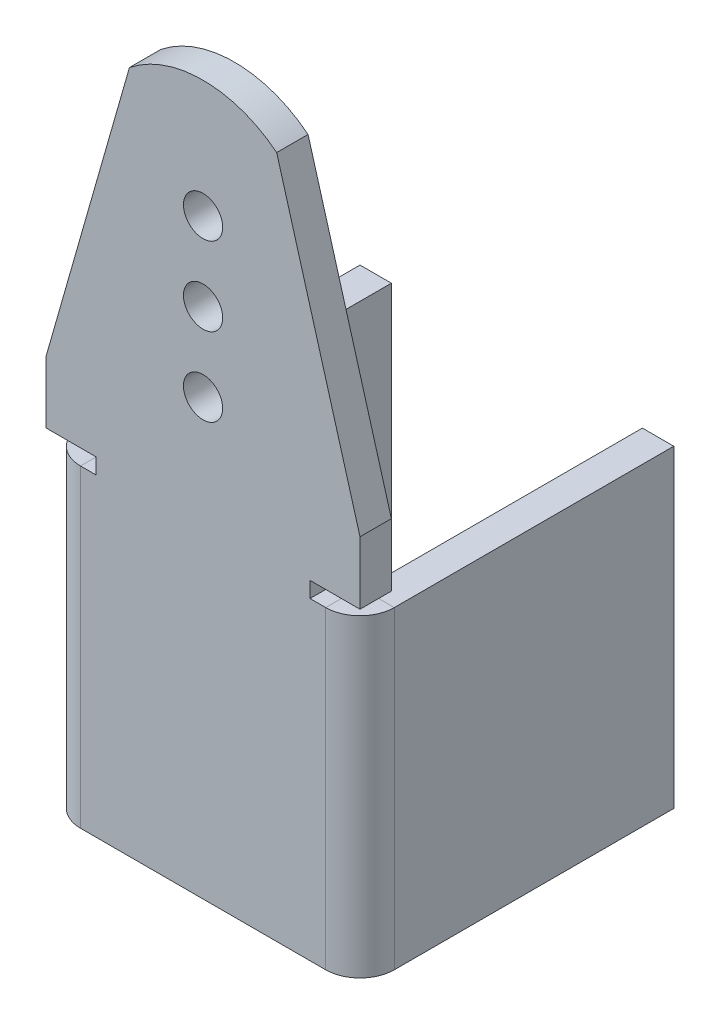
ISO-10303-21;
HEADER;
FILE_DESCRIPTION(('STEP AP214'),'2;1');
FILE_NAME('part.step','',(''),(''),'','','');
FILE_SCHEMA(('AUTOMOTIVE_DESIGN { 1 0 10303 214 1 1 1 1 }'));
ENDSEC;
DATA;
#1=APPLICATION_CONTEXT('core data for automotive mechanical design processes');
#2=APPLICATION_PROTOCOL_DEFINITION('international standard','automotive_design',2000,#1);
#3=PRODUCT_CONTEXT('',#1,'mechanical');
#4=PRODUCT('Part','Part','',(#3));
#5=PRODUCT_RELATED_PRODUCT_CATEGORY('part','',(#4));
#6=PRODUCT_DEFINITION_FORMATION('','',#4);
#7=PRODUCT_DEFINITION_CONTEXT('part definition',#1,'design');
#8=PRODUCT_DEFINITION('design','',#6,#7);
#9=PRODUCT_DEFINITION_SHAPE('','',#8);
#10=(LENGTH_UNIT() NAMED_UNIT(*) SI_UNIT(.MILLI.,.METRE.));
#11=(NAMED_UNIT(*) PLANE_ANGLE_UNIT() SI_UNIT($,.RADIAN.));
#12=(NAMED_UNIT(*) SI_UNIT($,.STERADIAN.) SOLID_ANGLE_UNIT());
#13=UNCERTAINTY_MEASURE_WITH_UNIT(LENGTH_MEASURE(1.E-05),#10,'distance_accuracy_value','');
#14=(GEOMETRIC_REPRESENTATION_CONTEXT(3) GLOBAL_UNCERTAINTY_ASSIGNED_CONTEXT((#13)) GLOBAL_UNIT_ASSIGNED_CONTEXT((#10,
#11,#12)) REPRESENTATION_CONTEXT('',''));
#15=CARTESIAN_POINT('',(0.,0.,0.));
#16=DIRECTION('',(0.,0.,1.));
#17=DIRECTION('',(1.,0.,0.));
#18=AXIS2_PLACEMENT_3D('',#15,#16,#17);
#19=CARTESIAN_POINT('',(39.9839854278637,150.82360777506,-8.));
#20=DIRECTION('',(0.,0.,-1.));
#21=DIRECTION('',(-1.,0.,0.));
#22=AXIS2_PLACEMENT_3D('',#19,#20,#21);
#23=PLANE('',#22);
#24=CARTESIAN_POINT('',(39.9839854278642,110.82360777506,-8.));
#25=DIRECTION('',(0.,0.,1.));
#26=DIRECTION('',(1.,0.,0.));
#27=AXIS2_PLACEMENT_3D('',#24,#25,#26);
#28=CIRCLE('',#27,5.);
#29=CARTESIAN_POINT('',(44.9839854278642,110.82360777506,-8.));
#30=VERTEX_POINT('',#29);
#31=EDGE_CURVE('E391',#30,#30,#28,.T.);
#32=ORIENTED_EDGE('',*,*,#31,.T.);
#33=EDGE_LOOP('',(#32));
#34=FACE_BOUND('',#33,.T.);
#35=CARTESIAN_POINT('',(39.9839854278639,130.82360777506,-8.));
#36=DIRECTION('',(0.,0.,1.));
#37=DIRECTION('',(1.,0.,0.));
#38=AXIS2_PLACEMENT_3D('',#35,#36,#37);
#39=CIRCLE('',#38,5.);
#40=CARTESIAN_POINT('',(44.9839854278639,130.82360777506,-8.));
#41=VERTEX_POINT('',#40);
#42=EDGE_CURVE('E397',#41,#41,#39,.T.);
#43=ORIENTED_EDGE('',*,*,#42,.T.);
#44=EDGE_LOOP('',(#43));
#45=FACE_BOUND('',#44,.T.);
#46=CARTESIAN_POINT('',(39.9839854278637,150.82360777506,-8.));
#47=DIRECTION('',(0.,0.,1.));
#48=DIRECTION('',(1.,0.,0.));
#49=AXIS2_PLACEMENT_3D('',#46,#47,#48);
#50=CIRCLE('',#49,5.);
#51=CARTESIAN_POINT('',(44.9839854278637,150.82360777506,-8.));
#52=VERTEX_POINT('',#51);
#53=EDGE_CURVE('E403',#52,#52,#50,.T.);
#54=ORIENTED_EDGE('',*,*,#53,.T.);
#55=EDGE_LOOP('',(#54));
#56=FACE_BOUND('',#55,.T.);
#57=DIRECTION('',(0.,-1.,0.));
#58=VECTOR('',#57,1.);
#59=CARTESIAN_POINT('',(12.7366,84.,-8.));
#60=LINE('',#59,#58);
#61=CARTESIAN_POINT('',(12.7366,84.,-8.));
#62=VERTEX_POINT('',#61);
#63=CARTESIAN_POINT('',(12.7366,80.,-8.));
#64=VERTEX_POINT('',#63);
#65=EDGE_CURVE('E308',#62,#64,#60,.T.);
#66=ORIENTED_EDGE('',*,*,#65,.F.);
#67=DIRECTION('',(1.,0.,0.));
#68=VECTOR('',#67,1.);
#69=CARTESIAN_POINT('',(0.,84.,-8.));
#70=LINE('',#69,#68);
#71=CARTESIAN_POINT('',(0.,84.,-8.));
#72=VERTEX_POINT('',#71);
#73=EDGE_CURVE('E304',#72,#62,#70,.T.);
#74=ORIENTED_EDGE('',*,*,#73,.F.);
#75=DIRECTION('',(0.,-1.,0.));
#76=VECTOR('',#75,1.);
#77=CARTESIAN_POINT('',(0.,0.,-8.));
#78=LINE('',#77,#76);
#79=CARTESIAN_POINT('',(0.,100.,-8.));
#80=VERTEX_POINT('',#79);
#81=EDGE_CURVE('E409',#80,#72,#78,.T.);
#82=ORIENTED_EDGE('',*,*,#81,.F.);
#83=DIRECTION('',(-0.274761416571079,-0.961512435678215,0.));
#84=VECTOR('',#83,1.);
#85=CARTESIAN_POINT('',(0.,100.,-8.));
#86=LINE('',#85,#84);
#87=CARTESIAN_POINT('',(21.2099630086313,174.223096705422,-8.));
#88=VERTEX_POINT('',#87);
#89=EDGE_CURVE('E423',#88,#80,#86,.T.);
#90=ORIENTED_EDGE('',*,*,#89,.F.);
#91=CARTESIAN_POINT('',(39.9839854278637,150.82360777506,-8.));
#92=DIRECTION('',(0.,0.,1.));
#93=DIRECTION('',(-1.,0.,0.));
#94=AXIS2_PLACEMENT_3D('',#91,#92,#93);
#95=CIRCLE('',#94,30.);
#96=CARTESIAN_POINT('',(58.7580078470961,174.223096705422,-8.));
#97=VERTEX_POINT('',#96);
#98=EDGE_CURVE('E420',#97,#88,#95,.T.);
#99=ORIENTED_EDGE('',*,*,#98,.F.);
#100=DIRECTION('',(-0.275144944227308,0.961402756219344,0.));
#101=VECTOR('',#100,1.);
#102=CARTESIAN_POINT('',(58.7580078470961,174.223096705422,-8.));
#103=LINE('',#102,#101);
#104=CARTESIAN_POINT('',(80.,100.,-8.));
#105=VERTEX_POINT('',#104);
#106=EDGE_CURVE('E417',#105,#97,#103,.T.);
#107=ORIENTED_EDGE('',*,*,#106,.F.);
#108=DIRECTION('',(0.,1.,0.));
#109=VECTOR('',#108,1.);
#110=CARTESIAN_POINT('',(80.,0.,-8.));
#111=LINE('',#110,#109);
#112=CARTESIAN_POINT('',(80.,84.,-8.));
#113=VERTEX_POINT('',#112);
#114=EDGE_CURVE('E415',#113,#105,#111,.T.);
#115=ORIENTED_EDGE('',*,*,#114,.F.);
#116=DIRECTION('',(1.,0.,0.));
#117=VECTOR('',#116,1.);
#118=CARTESIAN_POINT('',(67.2634,84.,-7.99999999999999));
#119=LINE('',#118,#117);
#120=CARTESIAN_POINT('',(67.2634,84.,-8.));
#121=VERTEX_POINT('',#120);
#122=EDGE_CURVE('E381',#121,#113,#119,.T.);
#123=ORIENTED_EDGE('',*,*,#122,.F.);
#124=DIRECTION('',(0.,1.,0.));
#125=VECTOR('',#124,1.);
#126=CARTESIAN_POINT('',(67.2634,80.,-7.99999999999999));
#127=LINE('',#126,#125);
#128=CARTESIAN_POINT('',(67.2634,80.,-8.));
#129=VERTEX_POINT('',#128);
#130=EDGE_CURVE('E377',#129,#121,#127,.T.);
#131=ORIENTED_EDGE('',*,*,#130,.F.);
#132=DIRECTION('',(-1.,0.,0.));
#133=VECTOR('',#132,1.);
#134=CARTESIAN_POINT('',(71.2634,80.,-7.99999999999999));
#135=LINE('',#134,#133);
#136=CARTESIAN_POINT('',(71.2634,80.,-8.));
#137=VERTEX_POINT('',#136);
#138=EDGE_CURVE('E106',#137,#129,#135,.T.);
#139=ORIENTED_EDGE('',*,*,#138,.F.);
#140=DIRECTION('',(0.,-1.,0.));
#141=VECTOR('',#140,1.);
#142=CARTESIAN_POINT('',(71.2634,0.,-7.99999999999999));
#143=LINE('',#142,#141);
#144=CARTESIAN_POINT('',(71.2634,0.,-8.));
#145=VERTEX_POINT('',#144);
#146=EDGE_CURVE('E364',#145,#137,#143,.F.);
#147=ORIENTED_EDGE('',*,*,#146,.F.);
#148=DIRECTION('',(1.,0.,0.));
#149=VECTOR('',#148,1.);
#150=CARTESIAN_POINT('',(0.,0.,-8.));
#151=LINE('',#150,#149);
#152=CARTESIAN_POINT('',(8.7366,0.,-8.));
#153=VERTEX_POINT('',#152);
#154=EDGE_CURVE('E412',#153,#145,#151,.T.);
#155=ORIENTED_EDGE('',*,*,#154,.F.);
#156=DIRECTION('',(0.,1.,0.));
#157=VECTOR('',#156,1.);
#158=CARTESIAN_POINT('',(8.7366,80.,-8.));
#159=LINE('',#158,#157);
#160=CARTESIAN_POINT('',(8.7366,80.,-8.));
#161=VERTEX_POINT('',#160);
#162=EDGE_CURVE('E294',#161,#153,#159,.F.);
#163=ORIENTED_EDGE('',*,*,#162,.F.);
#164=DIRECTION('',(-1.,0.,0.));
#165=VECTOR('',#164,1.);
#166=CARTESIAN_POINT('',(12.7366,80.,-8.));
#167=LINE('',#166,#165);
#168=EDGE_CURVE('E312',#64,#161,#167,.T.);
#169=ORIENTED_EDGE('',*,*,#168,.F.);
#170=EDGE_LOOP('',(#66,#74,#82,#90,#99,#107,#115,#123,#131,#139,#147,#155,#163,#169));
#171=FACE_BOUND('',#170,.T.);
#172=ADVANCED_FACE('F83',(#34,#45,#56,#171),#23,.T.);
#173=CARTESIAN_POINT('',(39.9839854278637,150.82360777506,0.));
#174=DIRECTION('',(0.,0.,-1.));
#175=DIRECTION('',(-1.,0.,0.));
#176=AXIS2_PLACEMENT_3D('',#173,#174,#175);
#177=PLANE('',#176);
#178=CARTESIAN_POINT('',(39.9839854278642,110.82360777506,0.));
#179=DIRECTION('',(0.,0.,1.));
#180=DIRECTION('',(1.,0.,0.));
#181=AXIS2_PLACEMENT_3D('',#178,#179,#180);
#182=CIRCLE('',#181,5.);
#183=CARTESIAN_POINT('',(44.9839854278642,110.82360777506,0.));
#184=VERTEX_POINT('',#183);
#185=EDGE_CURVE('E376',#184,#184,#182,.T.);
#186=ORIENTED_EDGE('',*,*,#185,.F.);
#187=EDGE_LOOP('',(#186));
#188=FACE_BOUND('',#187,.T.);
#189=CARTESIAN_POINT('',(39.9839854278639,130.82360777506,0.));
#190=DIRECTION('',(0.,0.,1.));
#191=DIRECTION('',(1.,0.,0.));
#192=AXIS2_PLACEMENT_3D('',#189,#190,#191);
#193=CIRCLE('',#192,5.);
#194=CARTESIAN_POINT('',(44.9839854278639,130.82360777506,0.));
#195=VERTEX_POINT('',#194);
#196=EDGE_CURVE('E394',#195,#195,#193,.T.);
#197=ORIENTED_EDGE('',*,*,#196,.F.);
#198=EDGE_LOOP('',(#197));
#199=FACE_BOUND('',#198,.T.);
#200=CARTESIAN_POINT('',(39.9839854278637,150.82360777506,0.));
#201=DIRECTION('',(0.,0.,1.));
#202=DIRECTION('',(1.,0.,0.));
#203=AXIS2_PLACEMENT_3D('',#200,#201,#202);
#204=CIRCLE('',#203,5.);
#205=CARTESIAN_POINT('',(44.9839854278637,150.82360777506,0.));
#206=VERTEX_POINT('',#205);
#207=EDGE_CURVE('E400',#206,#206,#204,.T.);
#208=ORIENTED_EDGE('',*,*,#207,.F.);
#209=EDGE_LOOP('',(#208));
#210=FACE_BOUND('',#209,.T.);
#211=DIRECTION('',(-1.,0.,0.));
#212=VECTOR('',#211,1.);
#213=CARTESIAN_POINT('',(39.9839854278637,84.,0.));
#214=LINE('',#213,#212);
#215=CARTESIAN_POINT('',(12.7366,84.,0.));
#216=VERTEX_POINT('',#215);
#217=CARTESIAN_POINT('',(0.,84.,0.));
#218=VERTEX_POINT('',#217);
#219=EDGE_CURVE('E98',#216,#218,#214,.T.);
#220=ORIENTED_EDGE('',*,*,#219,.F.);
#221=DIRECTION('',(0.,1.,0.));
#222=VECTOR('',#221,1.);
#223=CARTESIAN_POINT('',(12.7366,150.82360777506,0.));
#224=LINE('',#223,#222);
#225=CARTESIAN_POINT('',(12.7366,80.,0.));
#226=VERTEX_POINT('',#225);
#227=EDGE_CURVE('E13',#226,#216,#224,.T.);
#228=ORIENTED_EDGE('',*,*,#227,.F.);
#229=DIRECTION('',(1.,0.,0.));
#230=VECTOR('',#229,1.);
#231=CARTESIAN_POINT('',(39.9839854278637,80.,0.));
#232=LINE('',#231,#230);
#233=CARTESIAN_POINT('',(8.7366,80.,0.));
#234=VERTEX_POINT('',#233);
#235=EDGE_CURVE('E91',#234,#226,#232,.T.);
#236=ORIENTED_EDGE('',*,*,#235,.F.);
#237=DIRECTION('',(0.,1.,0.));
#238=VECTOR('',#237,1.);
#239=CARTESIAN_POINT('',(8.7366,80.,0.));
#240=LINE('',#239,#238);
#241=CARTESIAN_POINT('',(8.7366,0.,0.));
#242=VERTEX_POINT('',#241);
#243=EDGE_CURVE('E240',#234,#242,#240,.F.);
#244=ORIENTED_EDGE('',*,*,#243,.T.);
#245=DIRECTION('',(1.,0.,0.));
#246=VECTOR('',#245,1.);
#247=CARTESIAN_POINT('',(0.,0.,0.));
#248=LINE('',#247,#246);
#249=CARTESIAN_POINT('',(71.2634,0.,0.));
#250=VERTEX_POINT('',#249);
#251=EDGE_CURVE('E429',#242,#250,#248,.T.);
#252=ORIENTED_EDGE('',*,*,#251,.T.);
#253=DIRECTION('',(0.,-1.,0.));
#254=VECTOR('',#253,1.);
#255=CARTESIAN_POINT('',(71.2634,0.,0.));
#256=LINE('',#255,#254);
#257=CARTESIAN_POINT('',(71.2634,80.,0.));
#258=VERTEX_POINT('',#257);
#259=EDGE_CURVE('E352',#250,#258,#256,.F.);
#260=ORIENTED_EDGE('',*,*,#259,.T.);
#261=DIRECTION('',(1.,0.,0.));
#262=VECTOR('',#261,1.);
#263=CARTESIAN_POINT('',(39.9839854278637,80.,0.));
#264=LINE('',#263,#262);
#265=CARTESIAN_POINT('',(67.2634,80.,0.));
#266=VERTEX_POINT('',#265);
#267=EDGE_CURVE('E455',#266,#258,#264,.T.);
#268=ORIENTED_EDGE('',*,*,#267,.F.);
#269=DIRECTION('',(0.,-1.,0.));
#270=VECTOR('',#269,1.);
#271=CARTESIAN_POINT('',(67.2634,150.82360777506,0.));
#272=LINE('',#271,#270);
#273=CARTESIAN_POINT('',(67.2634,84.,0.));
#274=VERTEX_POINT('',#273);
#275=EDGE_CURVE('E452',#274,#266,#272,.T.);
#276=ORIENTED_EDGE('',*,*,#275,.F.);
#277=DIRECTION('',(-1.,0.,0.));
#278=VECTOR('',#277,1.);
#279=CARTESIAN_POINT('',(39.9839854278637,84.,0.));
#280=LINE('',#279,#278);
#281=CARTESIAN_POINT('',(80.,84.,0.));
#282=VERTEX_POINT('',#281);
#283=EDGE_CURVE('E443',#282,#274,#280,.T.);
#284=ORIENTED_EDGE('',*,*,#283,.F.);
#285=DIRECTION('',(0.,1.,0.));
#286=VECTOR('',#285,1.);
#287=CARTESIAN_POINT('',(80.,0.,0.));
#288=LINE('',#287,#286);
#289=CARTESIAN_POINT('',(80.,100.,0.));
#290=VERTEX_POINT('',#289);
#291=EDGE_CURVE('E431',#282,#290,#288,.T.);
#292=ORIENTED_EDGE('',*,*,#291,.T.);
#293=DIRECTION('',(-0.275144944227308,0.961402756219344,0.));
#294=VECTOR('',#293,1.);
#295=CARTESIAN_POINT('',(58.7580078470961,174.223096705422,0.));
#296=LINE('',#295,#294);
#297=CARTESIAN_POINT('',(58.7580078470961,174.223096705422,0.));
#298=VERTEX_POINT('',#297);
#299=EDGE_CURVE('E433',#290,#298,#296,.T.);
#300=ORIENTED_EDGE('',*,*,#299,.T.);
#301=CARTESIAN_POINT('',(39.9839854278637,150.82360777506,0.));
#302=DIRECTION('',(0.,0.,1.));
#303=DIRECTION('',(-1.,0.,0.));
#304=AXIS2_PLACEMENT_3D('',#301,#302,#303);
#305=CIRCLE('',#304,30.);
#306=CARTESIAN_POINT('',(21.2099630086313,174.223096705422,0.));
#307=VERTEX_POINT('',#306);
#308=EDGE_CURVE('E436',#298,#307,#305,.T.);
#309=ORIENTED_EDGE('',*,*,#308,.T.);
#310=DIRECTION('',(-0.274761416571079,-0.961512435678215,0.));
#311=VECTOR('',#310,1.);
#312=CARTESIAN_POINT('',(0.,100.,0.));
#313=LINE('',#312,#311);
#314=CARTESIAN_POINT('',(0.,100.,0.));
#315=VERTEX_POINT('',#314);
#316=EDGE_CURVE('E413',#307,#315,#313,.T.);
#317=ORIENTED_EDGE('',*,*,#316,.T.);
#318=DIRECTION('',(0.,-1.,0.));
#319=VECTOR('',#318,1.);
#320=CARTESIAN_POINT('',(0.,0.,0.));
#321=LINE('',#320,#319);
#322=EDGE_CURVE('E406',#315,#218,#321,.T.);
#323=ORIENTED_EDGE('',*,*,#322,.T.);
#324=EDGE_LOOP('',(#220,#228,#236,#244,#252,#260,#268,#276,#284,#292,#300,#309,#317,#323));
#325=FACE_BOUND('',#324,.T.);
#326=ADVANCED_FACE('F465',(#188,#199,#210,#325),#177,.F.);
#327=CARTESIAN_POINT('',(0.,0.,-8.));
#328=DIRECTION('',(-1.,0.,0.));
#329=DIRECTION('',(0.,0.,1.));
#330=AXIS2_PLACEMENT_3D('',#327,#328,#329);
#331=PLANE('',#330);
#332=ORIENTED_EDGE('',*,*,#81,.T.);
#333=DIRECTION('',(0.,0.,1.));
#334=VECTOR('',#333,1.);
#335=CARTESIAN_POINT('',(0.,84.,-8.));
#336=LINE('',#335,#334);
#337=EDGE_CURVE('E307',#72,#218,#336,.T.);
#338=ORIENTED_EDGE('',*,*,#337,.T.);
#339=ORIENTED_EDGE('',*,*,#322,.F.);
#340=DIRECTION('',(0.,0.,1.));
#341=VECTOR('',#340,1.);
#342=CARTESIAN_POINT('',(0.,100.,-8.));
#343=LINE('',#342,#341);
#344=EDGE_CURVE('E441',#80,#315,#343,.T.);
#345=ORIENTED_EDGE('',*,*,#344,.F.);
#346=EDGE_LOOP('',(#332,#338,#339,#345));
#347=FACE_BOUND('',#346,.T.);
#348=ADVANCED_FACE('F85',(#347),#331,.T.);
#349=CARTESIAN_POINT('',(80.,0.,-8.));
#350=DIRECTION('',(1.,0.,0.));
#351=DIRECTION('',(0.,0.,-1.));
#352=AXIS2_PLACEMENT_3D('',#349,#350,#351);
#353=PLANE('',#352);
#354=ORIENTED_EDGE('',*,*,#291,.F.);
#355=DIRECTION('',(0.,0.,1.));
#356=VECTOR('',#355,1.);
#357=CARTESIAN_POINT('',(80.,84.,-8.));
#358=LINE('',#357,#356);
#359=EDGE_CURVE('E384',#113,#282,#358,.T.);
#360=ORIENTED_EDGE('',*,*,#359,.F.);
#361=ORIENTED_EDGE('',*,*,#114,.T.);
#362=DIRECTION('',(0.,0.,1.));
#363=VECTOR('',#362,1.);
#364=CARTESIAN_POINT('',(80.,100.,-8.));
#365=LINE('',#364,#363);
#366=EDGE_CURVE('E426',#105,#290,#365,.T.);
#367=ORIENTED_EDGE('',*,*,#366,.T.);
#368=EDGE_LOOP('',(#354,#360,#361,#367));
#369=FACE_BOUND('',#368,.T.);
#370=ADVANCED_FACE('F523',(#369),#353,.T.);
#371=CARTESIAN_POINT('',(0.,0.,-8.));
#372=DIRECTION('',(0.,-1.,0.));
#373=DIRECTION('',(0.,0.,-1.));
#374=AXIS2_PLACEMENT_3D('',#371,#372,#373);
#375=PLANE('',#374);
#376=DIRECTION('',(0.,0.,1.));
#377=VECTOR('',#376,1.);
#378=CARTESIAN_POINT('',(8.7366,0.,-8.));
#379=LINE('',#378,#377);
#380=EDGE_CURVE('E298',#153,#242,#379,.T.);
#381=ORIENTED_EDGE('',*,*,#380,.F.);
#382=ORIENTED_EDGE('',*,*,#154,.T.);
#383=DIRECTION('',(0.,0.,1.));
#384=VECTOR('',#383,1.);
#385=CARTESIAN_POINT('',(71.2634,0.,-7.99999999999999));
#386=LINE('',#385,#384);
#387=EDGE_CURVE('E358',#145,#250,#386,.T.);
#388=ORIENTED_EDGE('',*,*,#387,.T.);
#389=ORIENTED_EDGE('',*,*,#251,.F.);
#390=EDGE_LOOP('',(#381,#382,#388,#389));
#391=FACE_BOUND('',#390,.T.);
#392=ADVANCED_FACE('F514',(#391),#375,.T.);
#393=CARTESIAN_POINT('',(0.,100.,-8.));
#394=DIRECTION('',(-0.961512435678215,0.274761416571079,0.));
#395=DIRECTION('',(-0.274761416571079,-0.961512435678216,0.));
#396=AXIS2_PLACEMENT_3D('',#393,#394,#395);
#397=PLANE('',#396);
#398=ORIENTED_EDGE('',*,*,#316,.F.);
#399=DIRECTION('',(0.,0.,1.));
#400=VECTOR('',#399,1.);
#401=CARTESIAN_POINT('',(21.2099630086313,174.223096705422,-8.));
#402=LINE('',#401,#400);
#403=EDGE_CURVE('E444',#88,#307,#402,.T.);
#404=ORIENTED_EDGE('',*,*,#403,.F.);
#405=ORIENTED_EDGE('',*,*,#89,.T.);
#406=ORIENTED_EDGE('',*,*,#344,.T.);
#407=EDGE_LOOP('',(#398,#404,#405,#406));
#408=FACE_BOUND('',#407,.T.);
#409=ADVANCED_FACE('F510',(#408),#397,.T.);
#410=CARTESIAN_POINT('',(39.9839854278637,150.82360777506,-8.));
#411=DIRECTION('',(0.,0.,1.));
#412=DIRECTION('',(1.,0.,0.));
#413=AXIS2_PLACEMENT_3D('',#410,#411,#412);
#414=CYLINDRICAL_SURFACE('',#413,30.);
#415=ORIENTED_EDGE('',*,*,#308,.F.);
#416=DIRECTION('',(0.,0.,1.));
#417=VECTOR('',#416,1.);
#418=CARTESIAN_POINT('',(58.7580078470961,174.223096705422,-8.));
#419=LINE('',#418,#417);
#420=EDGE_CURVE('E446',#97,#298,#419,.T.);
#421=ORIENTED_EDGE('',*,*,#420,.F.);
#422=ORIENTED_EDGE('',*,*,#98,.T.);
#423=ORIENTED_EDGE('',*,*,#403,.T.);
#424=EDGE_LOOP('',(#415,#421,#422,#423));
#425=FACE_BOUND('',#424,.T.);
#426=ADVANCED_FACE('F513',(#425),#414,.T.);
#427=CARTESIAN_POINT('',(58.7580078470961,174.223096705422,-8.));
#428=DIRECTION('',(0.961402756219344,0.275144944227308,0.));
#429=DIRECTION('',(-0.275144944227308,0.961402756219344,0.));
#430=AXIS2_PLACEMENT_3D('',#427,#428,#429);
#431=PLANE('',#430);
#432=ORIENTED_EDGE('',*,*,#299,.F.);
#433=ORIENTED_EDGE('',*,*,#366,.F.);
#434=ORIENTED_EDGE('',*,*,#106,.T.);
#435=ORIENTED_EDGE('',*,*,#420,.T.);
#436=EDGE_LOOP('',(#432,#433,#434,#435));
#437=FACE_BOUND('',#436,.T.);
#438=ADVANCED_FACE('F518',(#437),#431,.T.);
#439=CARTESIAN_POINT('',(39.9839854278637,150.82360777506,-8.));
#440=DIRECTION('',(0.,0.,1.));
#441=DIRECTION('',(1.,0.,0.));
#442=AXIS2_PLACEMENT_3D('',#439,#440,#441);
#443=CYLINDRICAL_SURFACE('',#442,5.);
#444=ORIENTED_EDGE('',*,*,#53,.F.);
#445=EDGE_LOOP('',(#444));
#446=FACE_BOUND('',#445,.T.);
#447=ORIENTED_EDGE('',*,*,#207,.T.);
#448=EDGE_LOOP('',(#447));
#449=FACE_BOUND('',#448,.T.);
#450=ADVANCED_FACE('F507',(#446,#449),#443,.F.);
#451=CARTESIAN_POINT('',(39.9839854278639,130.82360777506,-8.));
#452=DIRECTION('',(0.,0.,1.));
#453=DIRECTION('',(1.,0.,0.));
#454=AXIS2_PLACEMENT_3D('',#451,#452,#453);
#455=CYLINDRICAL_SURFACE('',#454,5.);
#456=ORIENTED_EDGE('',*,*,#42,.F.);
#457=EDGE_LOOP('',(#456));
#458=FACE_BOUND('',#457,.T.);
#459=ORIENTED_EDGE('',*,*,#196,.T.);
#460=EDGE_LOOP('',(#459));
#461=FACE_BOUND('',#460,.T.);
#462=ADVANCED_FACE('F598',(#458,#461),#455,.F.);
#463=CARTESIAN_POINT('',(39.9839854278642,110.82360777506,-8.));
#464=DIRECTION('',(0.,0.,1.));
#465=DIRECTION('',(1.,0.,0.));
#466=AXIS2_PLACEMENT_3D('',#463,#464,#465);
#467=CYLINDRICAL_SURFACE('',#466,5.);
#468=ORIENTED_EDGE('',*,*,#31,.F.);
#469=EDGE_LOOP('',(#468));
#470=FACE_BOUND('',#469,.T.);
#471=ORIENTED_EDGE('',*,*,#185,.T.);
#472=EDGE_LOOP('',(#471));
#473=FACE_BOUND('',#472,.T.);
#474=ADVANCED_FACE('F595',(#470,#473),#467,.F.);
#475=CARTESIAN_POINT('',(71.2634,80.,-7.99999999999999));
#476=DIRECTION('',(0.,1.,0.));
#477=DIRECTION('',(0.,0.,1.));
#478=AXIS2_PLACEMENT_3D('',#475,#476,#477);
#479=PLANE('',#478);
#480=DIRECTION('',(0.,0.,1.));
#481=VECTOR('',#480,1.);
#482=CARTESIAN_POINT('',(67.2634,80.,-7.99999999999999));
#483=LINE('',#482,#481);
#484=EDGE_CURVE('E380',#129,#266,#483,.T.);
#485=ORIENTED_EDGE('',*,*,#484,.T.);
#486=ORIENTED_EDGE('',*,*,#267,.T.);
#487=DIRECTION('',(0.,0.,1.));
#488=VECTOR('',#487,1.);
#489=CARTESIAN_POINT('',(71.2634,80.,-7.99999999999999));
#490=LINE('',#489,#488);
#491=EDGE_CURVE('E369',#137,#258,#490,.T.);
#492=ORIENTED_EDGE('',*,*,#491,.F.);
#493=ORIENTED_EDGE('',*,*,#138,.T.);
#494=EDGE_LOOP('',(#485,#486,#492,#493));
#495=FACE_BOUND('',#494,.T.);
#496=ADVANCED_FACE('F591',(#495),#479,.T.);
#497=CARTESIAN_POINT('',(67.2634,80.,-7.99999999999999));
#498=DIRECTION('',(1.,0.,0.));
#499=DIRECTION('',(0.,0.,-1.));
#500=AXIS2_PLACEMENT_3D('',#497,#498,#499);
#501=PLANE('',#500);
#502=DIRECTION('',(0.,0.,1.));
#503=VECTOR('',#502,1.);
#504=CARTESIAN_POINT('',(67.2634,84.,-7.99999999999999));
#505=LINE('',#504,#503);
#506=EDGE_CURVE('E372',#121,#274,#505,.T.);
#507=ORIENTED_EDGE('',*,*,#506,.T.);
#508=ORIENTED_EDGE('',*,*,#275,.T.);
#509=ORIENTED_EDGE('',*,*,#484,.F.);
#510=ORIENTED_EDGE('',*,*,#130,.T.);
#511=EDGE_LOOP('',(#507,#508,#509,#510));
#512=FACE_BOUND('',#511,.T.);
#513=ADVANCED_FACE('F587',(#512),#501,.T.);
#514=CARTESIAN_POINT('',(67.2634,84.,-7.99999999999999));
#515=DIRECTION('',(0.,-1.,0.));
#516=DIRECTION('',(0.,0.,-1.));
#517=AXIS2_PLACEMENT_3D('',#514,#515,#516);
#518=PLANE('',#517);
#519=ORIENTED_EDGE('',*,*,#359,.T.);
#520=ORIENTED_EDGE('',*,*,#283,.T.);
#521=ORIENTED_EDGE('',*,*,#506,.F.);
#522=ORIENTED_EDGE('',*,*,#122,.T.);
#523=EDGE_LOOP('',(#519,#520,#521,#522));
#524=FACE_BOUND('',#523,.T.);
#525=ADVANCED_FACE('F580',(#524),#518,.T.);
#526=CARTESIAN_POINT('',(71.2634,80.,-8.7366));
#527=DIRECTION('',(0.,1.,0.));
#528=DIRECTION('',(0.,0.,1.));
#529=AXIS2_PLACEMENT_3D('',#526,#527,#528);
#530=PLANE('',#529);
#531=DIRECTION('',(1.,0.,0.));
#532=VECTOR('',#531,1.);
#533=CARTESIAN_POINT('',(80.,80.,-8.73659999999997));
#534=LINE('',#533,#532);
#535=CARTESIAN_POINT('',(72.,80.,-8.7366));
#536=VERTEX_POINT('',#535);
#537=CARTESIAN_POINT('',(80.,80.,-8.73659999999998));
#538=VERTEX_POINT('',#537);
#539=EDGE_CURVE('E319',#536,#538,#534,.T.);
#540=ORIENTED_EDGE('',*,*,#539,.F.);
#541=CARTESIAN_POINT('',(71.2634,80.,-8.7366));
#542=DIRECTION('',(0.,-1.,0.));
#543=DIRECTION('',(0.,0.,-1.));
#544=AXIS2_PLACEMENT_3D('',#541,#542,#543);
#545=CIRCLE('',#544,0.736600000000004);
#546=EDGE_CURVE('E361',#137,#536,#545,.F.);
#547=ORIENTED_EDGE('',*,*,#546,.F.);
#548=ORIENTED_EDGE('',*,*,#491,.T.);
#549=CARTESIAN_POINT('',(71.2634,80.,-8.7366));
#550=DIRECTION('',(0.,-1.,0.));
#551=DIRECTION('',(0.,0.,-1.));
#552=AXIS2_PLACEMENT_3D('',#549,#550,#551);
#553=CIRCLE('',#552,8.7366);
#554=EDGE_CURVE('E354',#258,#538,#553,.F.);
#555=ORIENTED_EDGE('',*,*,#554,.T.);
#556=EDGE_LOOP('',(#540,#547,#548,#555));
#557=FACE_BOUND('',#556,.T.);
#558=ADVANCED_FACE('F577',(#557),#530,.T.);
#559=CARTESIAN_POINT('',(71.2634,0.,-8.7366));
#560=DIRECTION('',(0.,1.,0.));
#561=DIRECTION('',(0.,0.,1.));
#562=AXIS2_PLACEMENT_3D('',#559,#560,#561);
#563=PLANE('',#562);
#564=CARTESIAN_POINT('',(71.2634,0.,-8.7366));
#565=DIRECTION('',(0.,-1.,0.));
#566=DIRECTION('',(0.,0.,-1.));
#567=AXIS2_PLACEMENT_3D('',#564,#565,#566);
#568=CIRCLE('',#567,0.736600000000004);
#569=CARTESIAN_POINT('',(72.,0.,-8.7366));
#570=VERTEX_POINT('',#569);
#571=EDGE_CURVE('E322',#570,#145,#568,.T.);
#572=ORIENTED_EDGE('',*,*,#571,.F.);
#573=DIRECTION('',(1.,0.,0.));
#574=VECTOR('',#573,1.);
#575=CARTESIAN_POINT('',(72.,0.,-8.7366));
#576=LINE('',#575,#574);
#577=CARTESIAN_POINT('',(80.,0.,-8.73659999999997));
#578=VERTEX_POINT('',#577);
#579=EDGE_CURVE('E345',#570,#578,#576,.T.);
#580=ORIENTED_EDGE('',*,*,#579,.T.);
#581=CARTESIAN_POINT('',(71.2634,0.,-8.7366));
#582=DIRECTION('',(0.,-1.,0.));
#583=DIRECTION('',(0.,0.,-1.));
#584=AXIS2_PLACEMENT_3D('',#581,#582,#583);
#585=CIRCLE('',#584,8.7366);
#586=EDGE_CURVE('E355',#578,#250,#585,.T.);
#587=ORIENTED_EDGE('',*,*,#586,.T.);
#588=ORIENTED_EDGE('',*,*,#387,.F.);
#589=EDGE_LOOP('',(#572,#580,#587,#588));
#590=FACE_BOUND('',#589,.T.);
#591=ADVANCED_FACE('F572',(#590),#563,.F.);
#592=CARTESIAN_POINT('',(71.2634,0.,-8.7366));
#593=DIRECTION('',(0.,-1.,0.));
#594=DIRECTION('',(1.,0.,0.));
#595=AXIS2_PLACEMENT_3D('',#592,#593,#594);
#596=CYLINDRICAL_SURFACE('',#595,8.7366);
#597=ORIENTED_EDGE('',*,*,#259,.F.);
#598=ORIENTED_EDGE('',*,*,#586,.F.);
#599=DIRECTION('',(0.,-1.,0.));
#600=VECTOR('',#599,1.);
#601=CARTESIAN_POINT('',(80.,0.,-8.73659999999997));
#602=LINE('',#601,#600);
#603=EDGE_CURVE('E342',#538,#578,#602,.T.);
#604=ORIENTED_EDGE('',*,*,#603,.F.);
#605=ORIENTED_EDGE('',*,*,#554,.F.);
#606=EDGE_LOOP('',(#597,#598,#604,#605));
#607=FACE_BOUND('',#606,.T.);
#608=ADVANCED_FACE('F569',(#607),#596,.T.);
#609=CARTESIAN_POINT('',(71.2634,0.,-8.7366));
#610=DIRECTION('',(0.,-1.,0.));
#611=DIRECTION('',(1.,0.,0.));
#612=AXIS2_PLACEMENT_3D('',#609,#610,#611);
#613=CYLINDRICAL_SURFACE('',#612,0.736600000000004);
#614=ORIENTED_EDGE('',*,*,#146,.T.);
#615=ORIENTED_EDGE('',*,*,#546,.T.);
#616=DIRECTION('',(0.,1.,0.));
#617=VECTOR('',#616,1.);
#618=CARTESIAN_POINT('',(72.,80.,-8.7366));
#619=LINE('',#618,#617);
#620=EDGE_CURVE('E348',#536,#570,#619,.F.);
#621=ORIENTED_EDGE('',*,*,#620,.T.);
#622=ORIENTED_EDGE('',*,*,#571,.T.);
#623=EDGE_LOOP('',(#614,#615,#621,#622));
#624=FACE_BOUND('',#623,.T.);
#625=ADVANCED_FACE('F562',(#624),#613,.F.);
#626=CARTESIAN_POINT('',(80.,0.,-7.99999999999997));
#627=DIRECTION('',(0.,-1.,0.));
#628=DIRECTION('',(0.,0.,-1.));
#629=AXIS2_PLACEMENT_3D('',#626,#627,#628);
#630=PLANE('',#629);
#631=DIRECTION('',(0.,0.,1.));
#632=VECTOR('',#631,1.);
#633=CARTESIAN_POINT('',(80.,0.,-7.99999999999997));
#634=LINE('',#633,#632);
#635=CARTESIAN_POINT('',(80.0000000000002,0.,-80.));
#636=VERTEX_POINT('',#635);
#637=EDGE_CURVE('E326',#636,#578,#634,.T.);
#638=ORIENTED_EDGE('',*,*,#637,.T.);
#639=ORIENTED_EDGE('',*,*,#579,.F.);
#640=DIRECTION('',(0.,0.,-1.));
#641=VECTOR('',#640,1.);
#642=CARTESIAN_POINT('',(72.,0.,2.77555756156289E-13));
#643=LINE('',#642,#641);
#644=CARTESIAN_POINT('',(72.0000000000003,0.,-80.));
#645=VERTEX_POINT('',#644);
#646=EDGE_CURVE('E334',#645,#570,#643,.F.);
#647=ORIENTED_EDGE('',*,*,#646,.F.);
#648=DIRECTION('',(-1.,0.,0.));
#649=VECTOR('',#648,1.);
#650=CARTESIAN_POINT('',(80.0000000000002,0.,-80.));
#651=LINE('',#650,#649);
#652=EDGE_CURVE('E320',#636,#645,#651,.T.);
#653=ORIENTED_EDGE('',*,*,#652,.F.);
#654=EDGE_LOOP('',(#638,#639,#647,#653));
#655=FACE_BOUND('',#654,.T.);
#656=ADVANCED_FACE('F559',(#655),#630,.T.);
#657=CARTESIAN_POINT('',(80.0000000000002,80.,-80.));
#658=DIRECTION('',(0.,1.,0.));
#659=DIRECTION('',(0.,0.,1.));
#660=AXIS2_PLACEMENT_3D('',#657,#658,#659);
#661=PLANE('',#660);
#662=DIRECTION('',(0.,0.,1.));
#663=VECTOR('',#662,1.);
#664=CARTESIAN_POINT('',(72.,80.,2.62135991925384E-13));
#665=LINE('',#664,#663);
#666=CARTESIAN_POINT('',(72.0000000000003,80.,-80.));
#667=VERTEX_POINT('',#666);
#668=EDGE_CURVE('E340',#536,#667,#665,.F.);
#669=ORIENTED_EDGE('',*,*,#668,.F.);
#670=ORIENTED_EDGE('',*,*,#539,.T.);
#671=DIRECTION('',(0.,0.,-1.));
#672=VECTOR('',#671,1.);
#673=CARTESIAN_POINT('',(80.0000000000002,80.,-80.));
#674=LINE('',#673,#672);
#675=CARTESIAN_POINT('',(80.0000000000002,80.,-80.));
#676=VERTEX_POINT('',#675);
#677=EDGE_CURVE('E332',#538,#676,#674,.T.);
#678=ORIENTED_EDGE('',*,*,#677,.T.);
#679=DIRECTION('',(-1.,0.,0.));
#680=VECTOR('',#679,1.);
#681=CARTESIAN_POINT('',(80.0000000000002,80.,-80.));
#682=LINE('',#681,#680);
#683=EDGE_CURVE('E323',#676,#667,#682,.T.);
#684=ORIENTED_EDGE('',*,*,#683,.T.);
#685=EDGE_LOOP('',(#669,#670,#678,#684));
#686=FACE_BOUND('',#685,.T.);
#687=ADVANCED_FACE('F554',(#686),#661,.T.);
#688=CARTESIAN_POINT('',(80.,0.,3.05487606867034E-13));
#689=DIRECTION('',(1.,0.,0.));
#690=DIRECTION('',(0.,0.,-1.));
#691=AXIS2_PLACEMENT_3D('',#688,#689,#690);
#692=PLANE('',#691);
#693=ORIENTED_EDGE('',*,*,#677,.F.);
#694=ORIENTED_EDGE('',*,*,#603,.T.);
#695=ORIENTED_EDGE('',*,*,#637,.F.);
#696=DIRECTION('',(0.,-1.,0.));
#697=VECTOR('',#696,1.);
#698=CARTESIAN_POINT('',(80.0000000000002,0.,-80.));
#699=LINE('',#698,#697);
#700=EDGE_CURVE('E329',#676,#636,#699,.T.);
#701=ORIENTED_EDGE('',*,*,#700,.F.);
#702=EDGE_LOOP('',(#693,#694,#695,#701));
#703=FACE_BOUND('',#702,.T.);
#704=ADVANCED_FACE('F550',(#703),#692,.T.);
#705=CARTESIAN_POINT('',(72.,0.,2.77555756156289E-13));
#706=DIRECTION('',(1.,0.,0.));
#707=DIRECTION('',(0.,0.,-1.));
#708=AXIS2_PLACEMENT_3D('',#705,#706,#707);
#709=PLANE('',#708);
#710=ORIENTED_EDGE('',*,*,#620,.F.);
#711=ORIENTED_EDGE('',*,*,#668,.T.);
#712=DIRECTION('',(0.,1.,0.));
#713=VECTOR('',#712,1.);
#714=CARTESIAN_POINT('',(72.0000000000003,0.,-80.));
#715=LINE('',#714,#713);
#716=EDGE_CURVE('E337',#667,#645,#715,.F.);
#717=ORIENTED_EDGE('',*,*,#716,.T.);
#718=ORIENTED_EDGE('',*,*,#646,.T.);
#719=EDGE_LOOP('',(#710,#711,#717,#718));
#720=FACE_BOUND('',#719,.T.);
#721=ADVANCED_FACE('F553',(#720),#709,.F.);
#722=CARTESIAN_POINT('',(80.0000000000002,0.,-80.));
#723=DIRECTION('',(0.,0.,-1.));
#724=DIRECTION('',(-1.,0.,0.));
#725=AXIS2_PLACEMENT_3D('',#722,#723,#724);
#726=PLANE('',#725);
#727=ORIENTED_EDGE('',*,*,#716,.F.);
#728=ORIENTED_EDGE('',*,*,#683,.F.);
#729=ORIENTED_EDGE('',*,*,#700,.T.);
#730=ORIENTED_EDGE('',*,*,#652,.T.);
#731=EDGE_LOOP('',(#727,#728,#729,#730));
#732=FACE_BOUND('',#731,.T.);
#733=ADVANCED_FACE('F548',(#732),#726,.T.);
#734=CARTESIAN_POINT('',(12.7366,84.,-8.));
#735=DIRECTION('',(-1.,0.,0.));
#736=DIRECTION('',(0.,0.,1.));
#737=AXIS2_PLACEMENT_3D('',#734,#735,#736);
#738=PLANE('',#737);
#739=DIRECTION('',(0.,0.,1.));
#740=VECTOR('',#739,1.);
#741=CARTESIAN_POINT('',(12.7366,80.,-8.));
#742=LINE('',#741,#740);
#743=EDGE_CURVE('E301',#64,#226,#742,.T.);
#744=ORIENTED_EDGE('',*,*,#743,.T.);
#745=ORIENTED_EDGE('',*,*,#227,.T.);
#746=DIRECTION('',(0.,0.,1.));
#747=VECTOR('',#746,1.);
#748=CARTESIAN_POINT('',(12.7366,84.,-8.));
#749=LINE('',#748,#747);
#750=EDGE_CURVE('E311',#62,#216,#749,.T.);
#751=ORIENTED_EDGE('',*,*,#750,.F.);
#752=ORIENTED_EDGE('',*,*,#65,.T.);
#753=EDGE_LOOP('',(#744,#745,#751,#752));
#754=FACE_BOUND('',#753,.T.);
#755=ADVANCED_FACE('F462',(#754),#738,.T.);
#756=CARTESIAN_POINT('',(12.7366,80.,-8.));
#757=DIRECTION('',(0.,1.,0.));
#758=DIRECTION('',(0.,0.,1.));
#759=AXIS2_PLACEMENT_3D('',#756,#757,#758);
#760=PLANE('',#759);
#761=DIRECTION('',(0.,0.,1.));
#762=VECTOR('',#761,1.);
#763=CARTESIAN_POINT('',(8.7366,80.,-8.));
#764=LINE('',#763,#762);
#765=EDGE_CURVE('E290',#161,#234,#764,.T.);
#766=ORIENTED_EDGE('',*,*,#765,.T.);
#767=ORIENTED_EDGE('',*,*,#235,.T.);
#768=ORIENTED_EDGE('',*,*,#743,.F.);
#769=ORIENTED_EDGE('',*,*,#168,.T.);
#770=EDGE_LOOP('',(#766,#767,#768,#769));
#771=FACE_BOUND('',#770,.T.);
#772=ADVANCED_FACE('F458',(#771),#760,.T.);
#773=CARTESIAN_POINT('',(0.,84.,-8.));
#774=DIRECTION('',(0.,-1.,0.));
#775=DIRECTION('',(0.,0.,-1.));
#776=AXIS2_PLACEMENT_3D('',#773,#774,#775);
#777=PLANE('',#776);
#778=ORIENTED_EDGE('',*,*,#750,.T.);
#779=ORIENTED_EDGE('',*,*,#219,.T.);
#780=ORIENTED_EDGE('',*,*,#337,.F.);
#781=ORIENTED_EDGE('',*,*,#73,.T.);
#782=EDGE_LOOP('',(#778,#779,#780,#781));
#783=FACE_BOUND('',#782,.T.);
#784=ADVANCED_FACE('F471',(#783),#777,.T.);
#785=CARTESIAN_POINT('',(8.7366,0.,-8.7366));
#786=DIRECTION('',(0.,-1.,0.));
#787=DIRECTION('',(0.,0.,-1.));
#788=AXIS2_PLACEMENT_3D('',#785,#786,#787);
#789=PLANE('',#788);
#790=DIRECTION('',(-1.,0.,0.));
#791=VECTOR('',#790,1.);
#792=CARTESIAN_POINT('',(0.,0.,-8.73659999999997));
#793=LINE('',#792,#791);
#794=CARTESIAN_POINT('',(8.,0.,-8.7366));
#795=VERTEX_POINT('',#794);
#796=CARTESIAN_POINT('',(0.,0.,-8.73659999999998));
#797=VERTEX_POINT('',#796);
#798=EDGE_CURVE('E285',#795,#797,#793,.T.);
#799=ORIENTED_EDGE('',*,*,#798,.F.);
#800=CARTESIAN_POINT('',(8.7366,0.,-8.7366));
#801=DIRECTION('',(0.,1.,0.));
#802=DIRECTION('',(0.,0.,1.));
#803=AXIS2_PLACEMENT_3D('',#800,#801,#802);
#804=CIRCLE('',#803,0.7366);
#805=EDGE_CURVE('E243',#153,#795,#804,.F.);
#806=ORIENTED_EDGE('',*,*,#805,.F.);
#807=ORIENTED_EDGE('',*,*,#380,.T.);
#808=CARTESIAN_POINT('',(8.7366,0.,-8.7366));
#809=DIRECTION('',(0.,1.,0.));
#810=DIRECTION('',(0.,0.,1.));
#811=AXIS2_PLACEMENT_3D('',#808,#809,#810);
#812=CIRCLE('',#811,8.7366);
#813=EDGE_CURVE('E289',#242,#797,#812,.F.);
#814=ORIENTED_EDGE('',*,*,#813,.T.);
#815=EDGE_LOOP('',(#799,#806,#807,#814));
#816=FACE_BOUND('',#815,.T.);
#817=ADVANCED_FACE('F534',(#816),#789,.T.);
#818=CARTESIAN_POINT('',(8.7366,80.,-8.7366));
#819=DIRECTION('',(0.,-1.,0.));
#820=DIRECTION('',(0.,0.,-1.));
#821=AXIS2_PLACEMENT_3D('',#818,#819,#820);
#822=PLANE('',#821);
#823=CARTESIAN_POINT('',(8.7366,80.,-8.7366));
#824=DIRECTION('',(0.,1.,0.));
#825=DIRECTION('',(0.,0.,1.));
#826=AXIS2_PLACEMENT_3D('',#823,#824,#825);
#827=CIRCLE('',#826,0.7366);
#828=CARTESIAN_POINT('',(8.,80.,-8.7366));
#829=VERTEX_POINT('',#828);
#830=EDGE_CURVE('E250',#829,#161,#827,.T.);
#831=ORIENTED_EDGE('',*,*,#830,.F.);
#832=DIRECTION('',(-1.,0.,0.));
#833=VECTOR('',#832,1.);
#834=CARTESIAN_POINT('',(8.,80.,-8.7366));
#835=LINE('',#834,#833);
#836=CARTESIAN_POINT('',(0.,80.,-8.73659999999997));
#837=VERTEX_POINT('',#836);
#838=EDGE_CURVE('E247',#829,#837,#835,.T.);
#839=ORIENTED_EDGE('',*,*,#838,.T.);
#840=CARTESIAN_POINT('',(8.7366,80.,-8.7366));
#841=DIRECTION('',(0.,1.,0.));
#842=DIRECTION('',(0.,0.,1.));
#843=AXIS2_PLACEMENT_3D('',#840,#841,#842);
#844=CIRCLE('',#843,8.7366);
#845=EDGE_CURVE('E233',#837,#234,#844,.T.);
#846=ORIENTED_EDGE('',*,*,#845,.T.);
#847=ORIENTED_EDGE('',*,*,#765,.F.);
#848=EDGE_LOOP('',(#831,#839,#846,#847));
#849=FACE_BOUND('',#848,.T.);
#850=ADVANCED_FACE('F248',(#849),#822,.F.);
#851=CARTESIAN_POINT('',(8.7366,80.,-8.7366));
#852=DIRECTION('',(0.,1.,0.));
#853=DIRECTION('',(-1.,0.,0.));
#854=AXIS2_PLACEMENT_3D('',#851,#852,#853);
#855=CYLINDRICAL_SURFACE('',#854,8.7366);
#856=ORIENTED_EDGE('',*,*,#243,.F.);
#857=ORIENTED_EDGE('',*,*,#845,.F.);
#858=DIRECTION('',(0.,1.,0.));
#859=VECTOR('',#858,1.);
#860=CARTESIAN_POINT('',(0.,0.,-8.73659999999997));
#861=LINE('',#860,#859);
#862=EDGE_CURVE('E238',#797,#837,#861,.T.);
#863=ORIENTED_EDGE('',*,*,#862,.F.);
#864=ORIENTED_EDGE('',*,*,#813,.F.);
#865=EDGE_LOOP('',(#856,#857,#863,#864));
#866=FACE_BOUND('',#865,.T.);
#867=ADVANCED_FACE('F235',(#866),#855,.T.);
#868=CARTESIAN_POINT('',(8.7366,80.,-8.7366));
#869=DIRECTION('',(0.,1.,0.));
#870=DIRECTION('',(-1.,0.,0.));
#871=AXIS2_PLACEMENT_3D('',#868,#869,#870);
#872=CYLINDRICAL_SURFACE('',#871,0.7366);
#873=ORIENTED_EDGE('',*,*,#162,.T.);
#874=ORIENTED_EDGE('',*,*,#805,.T.);
#875=DIRECTION('',(0.,-1.,0.));
#876=VECTOR('',#875,1.);
#877=CARTESIAN_POINT('',(8.,0.,-8.7366));
#878=LINE('',#877,#876);
#879=EDGE_CURVE('E255',#795,#829,#878,.F.);
#880=ORIENTED_EDGE('',*,*,#879,.T.);
#881=ORIENTED_EDGE('',*,*,#830,.T.);
#882=EDGE_LOOP('',(#873,#874,#880,#881));
#883=FACE_BOUND('',#882,.T.);
#884=ADVANCED_FACE('F477',(#883),#872,.F.);
#885=CARTESIAN_POINT('',(0.,80.,-7.99999999999997));
#886=DIRECTION('',(0.,1.,0.));
#887=DIRECTION('',(0.,0.,1.));
#888=AXIS2_PLACEMENT_3D('',#885,#886,#887);
#889=PLANE('',#888);
#890=DIRECTION('',(0.,0.,1.));
#891=VECTOR('',#890,1.);
#892=CARTESIAN_POINT('',(0.,80.,-7.99999999999997));
#893=LINE('',#892,#891);
#894=CARTESIAN_POINT('',(-2.51562931491822E-13,80.,-80.));
#895=VERTEX_POINT('',#894);
#896=EDGE_CURVE('E262',#895,#837,#893,.T.);
#897=ORIENTED_EDGE('',*,*,#896,.T.);
#898=ORIENTED_EDGE('',*,*,#838,.F.);
#899=DIRECTION('',(0.,0.,-1.));
#900=VECTOR('',#899,1.);
#901=CARTESIAN_POINT('',(8.00000000000003,80.,0.));
#902=LINE('',#901,#900);
#903=CARTESIAN_POINT('',(7.99999999999975,80.,-80.));
#904=VERTEX_POINT('',#903);
#905=EDGE_CURVE('E278',#904,#829,#902,.F.);
#906=ORIENTED_EDGE('',*,*,#905,.F.);
#907=DIRECTION('',(1.,0.,0.));
#908=VECTOR('',#907,1.);
#909=CARTESIAN_POINT('',(-2.51534904016637E-13,80.,-80.));
#910=LINE('',#909,#908);
#911=EDGE_CURVE('E267',#895,#904,#910,.T.);
#912=ORIENTED_EDGE('',*,*,#911,.F.);
#913=EDGE_LOOP('',(#897,#898,#906,#912));
#914=FACE_BOUND('',#913,.T.);
#915=ADVANCED_FACE('F266',(#914),#889,.T.);
#916=CARTESIAN_POINT('',(-2.51534904016637E-13,0.,-80.));
#917=DIRECTION('',(0.,-1.,0.));
#918=DIRECTION('',(0.,0.,-1.));
#919=AXIS2_PLACEMENT_3D('',#916,#917,#918);
#920=PLANE('',#919);
#921=DIRECTION('',(0.,0.,1.));
#922=VECTOR('',#921,1.);
#923=CARTESIAN_POINT('',(8.00000000000003,0.,0.));
#924=LINE('',#923,#922);
#925=CARTESIAN_POINT('',(7.99999999999975,0.,-80.));
#926=VERTEX_POINT('',#925);
#927=EDGE_CURVE('E264',#795,#926,#924,.F.);
#928=ORIENTED_EDGE('',*,*,#927,.F.);
#929=ORIENTED_EDGE('',*,*,#798,.T.);
#930=DIRECTION('',(0.,0.,-1.));
#931=VECTOR('',#930,1.);
#932=CARTESIAN_POINT('',(-2.51562931491822E-13,0.,-80.));
#933=LINE('',#932,#931);
#934=CARTESIAN_POINT('',(-2.51562931491822E-13,0.,-80.));
#935=VERTEX_POINT('',#934);
#936=EDGE_CURVE('E263',#797,#935,#933,.T.);
#937=ORIENTED_EDGE('',*,*,#936,.T.);
#938=DIRECTION('',(1.,0.,0.));
#939=VECTOR('',#938,1.);
#940=CARTESIAN_POINT('',(-2.51534904016637E-13,0.,-80.));
#941=LINE('',#940,#939);
#942=EDGE_CURVE('E269',#935,#926,#941,.T.);
#943=ORIENTED_EDGE('',*,*,#942,.T.);
#944=EDGE_LOOP('',(#928,#929,#937,#943));
#945=FACE_BOUND('',#944,.T.);
#946=ADVANCED_FACE('F483',(#945),#920,.T.);
#947=CARTESIAN_POINT('',(0.,0.,0.));
#948=DIRECTION('',(-1.,0.,0.));
#949=DIRECTION('',(0.,0.,1.));
#950=AXIS2_PLACEMENT_3D('',#947,#948,#949);
#951=PLANE('',#950);
#952=ORIENTED_EDGE('',*,*,#936,.F.);
#953=ORIENTED_EDGE('',*,*,#862,.T.);
#954=ORIENTED_EDGE('',*,*,#896,.F.);
#955=DIRECTION('',(0.,1.,0.));
#956=VECTOR('',#955,1.);
#957=CARTESIAN_POINT('',(-2.51562931491822E-13,80.,-80.));
#958=LINE('',#957,#956);
#959=EDGE_CURVE('E270',#935,#895,#958,.T.);
#960=ORIENTED_EDGE('',*,*,#959,.F.);
#961=EDGE_LOOP('',(#952,#953,#954,#960));
#962=FACE_BOUND('',#961,.T.);
#963=ADVANCED_FACE('F260',(#962),#951,.T.);
#964=CARTESIAN_POINT('',(8.00000000000003,0.,0.));
#965=DIRECTION('',(-1.,0.,0.));
#966=DIRECTION('',(0.,0.,1.));
#967=AXIS2_PLACEMENT_3D('',#964,#965,#966);
#968=PLANE('',#967);
#969=ORIENTED_EDGE('',*,*,#879,.F.);
#970=ORIENTED_EDGE('',*,*,#927,.T.);
#971=DIRECTION('',(0.,-1.,0.));
#972=VECTOR('',#971,1.);
#973=CARTESIAN_POINT('',(7.99999999999975,0.,-80.));
#974=LINE('',#973,#972);
#975=EDGE_CURVE('E280',#926,#904,#974,.F.);
#976=ORIENTED_EDGE('',*,*,#975,.T.);
#977=ORIENTED_EDGE('',*,*,#905,.T.);
#978=EDGE_LOOP('',(#969,#970,#976,#977));
#979=FACE_BOUND('',#978,.T.);
#980=ADVANCED_FACE('F481',(#979),#968,.F.);
#981=CARTESIAN_POINT('',(-2.51534904016637E-13,80.,-80.));
#982=DIRECTION('',(0.,0.,-1.));
#983=DIRECTION('',(-1.,0.,0.));
#984=AXIS2_PLACEMENT_3D('',#981,#982,#983);
#985=PLANE('',#984);
#986=ORIENTED_EDGE('',*,*,#975,.F.);
#987=ORIENTED_EDGE('',*,*,#942,.F.);
#988=ORIENTED_EDGE('',*,*,#959,.T.);
#989=ORIENTED_EDGE('',*,*,#911,.T.);
#990=EDGE_LOOP('',(#986,#987,#988,#989));
#991=FACE_BOUND('',#990,.T.);
#992=ADVANCED_FACE('F487',(#991),#985,.T.);
#993=CLOSED_SHELL('',(#172,#326,#348,#370,#392,#409,#426,#438,#450,#462,#474,#496,#513,#525,
#558,#591,#608,#625,#656,#687,#704,#721,#733,#755,#772,#784,#817,#850,#867,#884,#915,#946,#963,
#980,#992));
#994=MANIFOLD_SOLID_BREP('B2',#993);
#995=ADVANCED_BREP_SHAPE_REPRESENTATION('',(#18,#994),#14);
#996=SHAPE_DEFINITION_REPRESENTATION(#9,#995);
ENDSEC;
END-ISO-10303-21;
